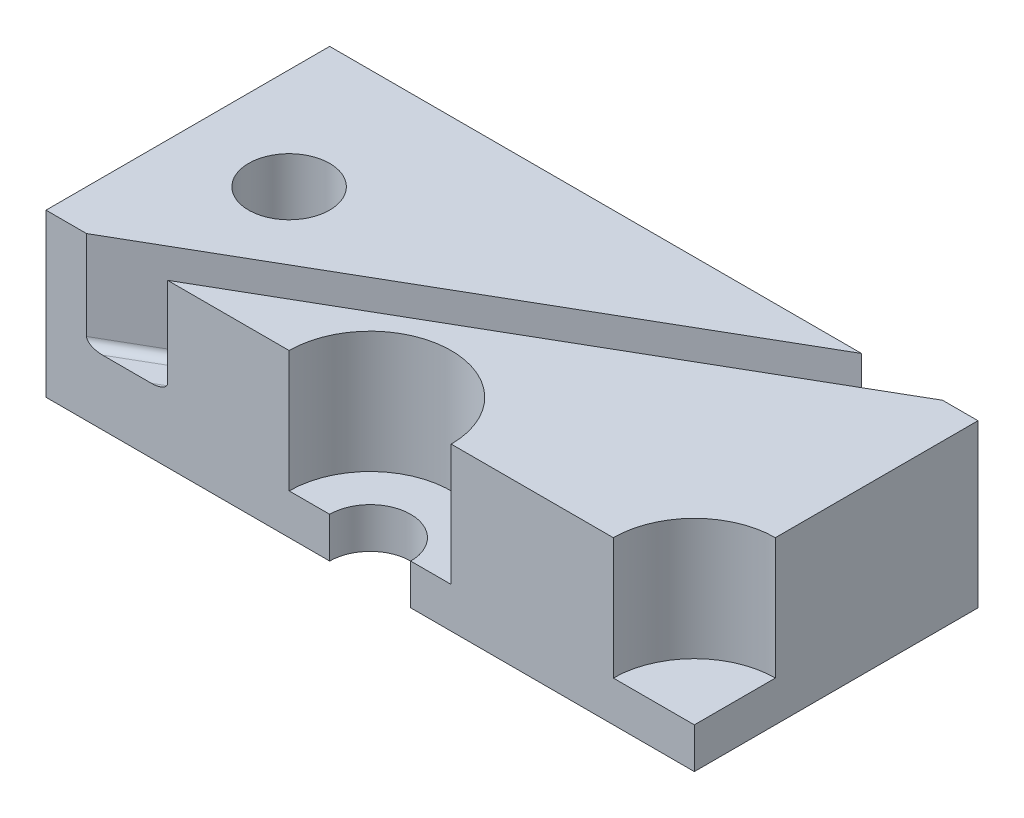
ISO-10303-21;
HEADER;
FILE_DESCRIPTION(('STEP AP214'),'2;1');
FILE_NAME('part.step','',(''),(''),'','','');
FILE_SCHEMA(('AUTOMOTIVE_DESIGN { 1 0 10303 214 1 1 1 1 }'));
ENDSEC;
DATA;
#1=APPLICATION_CONTEXT('core data for automotive mechanical design processes');
#2=APPLICATION_PROTOCOL_DEFINITION('international standard','automotive_design',2000,#1);
#3=PRODUCT_CONTEXT('',#1,'mechanical');
#4=PRODUCT('Part','Part','',(#3));
#5=PRODUCT_RELATED_PRODUCT_CATEGORY('part','',(#4));
#6=PRODUCT_DEFINITION_FORMATION('','',#4);
#7=PRODUCT_DEFINITION_CONTEXT('part definition',#1,'design');
#8=PRODUCT_DEFINITION('design','',#6,#7);
#9=PRODUCT_DEFINITION_SHAPE('','',#8);
#10=(LENGTH_UNIT() NAMED_UNIT(*) SI_UNIT(.MILLI.,.METRE.));
#11=(NAMED_UNIT(*) PLANE_ANGLE_UNIT() SI_UNIT($,.RADIAN.));
#12=(NAMED_UNIT(*) SI_UNIT($,.STERADIAN.) SOLID_ANGLE_UNIT());
#13=UNCERTAINTY_MEASURE_WITH_UNIT(LENGTH_MEASURE(1.E-05),#10,'distance_accuracy_value','');
#14=(GEOMETRIC_REPRESENTATION_CONTEXT(3) GLOBAL_UNCERTAINTY_ASSIGNED_CONTEXT((#13)) GLOBAL_UNIT_ASSIGNED_CONTEXT((#10,
#11,#12)) REPRESENTATION_CONTEXT('',''));
#15=CARTESIAN_POINT('',(0.,0.,0.));
#16=DIRECTION('',(0.,0.,1.));
#17=DIRECTION('',(1.,0.,0.));
#18=AXIS2_PLACEMENT_3D('',#15,#16,#17);
#19=CARTESIAN_POINT('',(120.996363636343,84.2718637239819,88.9));
#20=DIRECTION('',(0.,-1.,0.));
#21=DIRECTION('',(1.,0.,0.));
#22=AXIS2_PLACEMENT_3D('',#19,#20,#21);
#23=PLANE('',#22);
#24=CARTESIAN_POINT('',(-50.4536363636565,84.2718637239819,44.45));
#25=DIRECTION('',(0.,1.,0.));
#26=DIRECTION('',(-1.,0.,0.));
#27=AXIS2_PLACEMENT_3D('',#24,#25,#26);
#28=CIRCLE('',#27,12.7);
#29=CARTESIAN_POINT('',(-63.1536363636565,84.2718637239819,44.45));
#30=VERTEX_POINT('',#29);
#31=EDGE_CURVE('E269',#30,#30,#28,.T.);
#32=ORIENTED_EDGE('',*,*,#31,.F.);
#33=EDGE_LOOP('',(#32));
#34=FACE_BOUND('',#33,.T.);
#35=DIRECTION('',(-1.,0.,0.));
#36=VECTOR('',#35,1.);
#37=CARTESIAN_POINT('',(120.996363636343,84.2718637239819,88.9));
#38=LINE('',#37,#36);
#39=CARTESIAN_POINT('',(-69.5036363636565,84.2718637239819,88.9));
#40=VERTEX_POINT('',#39);
#41=CARTESIAN_POINT('',(-82.2036363636565,84.2718637239819,88.9));
#42=VERTEX_POINT('',#41);
#43=EDGE_CURVE('E181',#40,#42,#38,.T.);
#44=ORIENTED_EDGE('',*,*,#43,.F.);
#45=DIRECTION('',(-0.866025403784438,0.,0.500000000000001));
#46=VECTOR('',#45,1.);
#47=CARTESIAN_POINT('',(-69.5036363636565,84.2718637239819,88.9));
#48=LINE('',#47,#46);
#49=CARTESIAN_POINT('',(84.4756804292161,84.2718637239819,0.));
#50=VERTEX_POINT('',#49);
#51=EDGE_CURVE('E174',#50,#40,#48,.T.);
#52=ORIENTED_EDGE('',*,*,#51,.F.);
#53=DIRECTION('',(-1.,0.,0.));
#54=VECTOR('',#53,1.);
#55=CARTESIAN_POINT('',(120.996363636343,84.2718637239819,0.));
#56=LINE('',#55,#54);
#57=CARTESIAN_POINT('',(-82.2036363636565,84.2718637239819,0.));
#58=VERTEX_POINT('',#57);
#59=EDGE_CURVE('E198',#50,#58,#56,.T.);
#60=ORIENTED_EDGE('',*,*,#59,.T.);
#61=DIRECTION('',(0.,0.,-1.));
#62=VECTOR('',#61,1.);
#63=CARTESIAN_POINT('',(-82.2036363636565,84.2718637239819,88.9));
#64=LINE('',#63,#62);
#65=EDGE_CURVE('E184',#42,#58,#64,.T.);
#66=ORIENTED_EDGE('',*,*,#65,.F.);
#67=EDGE_LOOP('',(#44,#52,#60,#66));
#68=FACE_BOUND('',#67,.T.);
#69=ADVANCED_FACE('F43',(#34,#68),#23,.F.);
#70=CARTESIAN_POINT('',(0.,0.,88.9));
#71=DIRECTION('',(0.,0.,1.));
#72=DIRECTION('',(1.,0.,0.));
#73=AXIS2_PLACEMENT_3D('',#70,#71,#72);
#74=PLANE('',#73);
#75=DIRECTION('',(0.,1.,0.));
#76=VECTOR('',#75,1.);
#77=CARTESIAN_POINT('',(32.0963636363435,33.4718637239819,88.9));
#78=LINE('',#77,#76);
#79=CARTESIAN_POINT('',(32.0963636363435,33.4718637239819,88.9));
#80=VERTEX_POINT('',#79);
#81=CARTESIAN_POINT('',(32.0963636363435,46.1718637239819,88.9));
#82=VERTEX_POINT('',#81);
#83=EDGE_CURVE('E262',#80,#82,#78,.T.);
#84=ORIENTED_EDGE('',*,*,#83,.F.);
#85=DIRECTION('',(1.,0.,0.));
#86=VECTOR('',#85,1.);
#87=CARTESIAN_POINT('',(-82.2036363636565,33.4718637239819,88.9));
#88=LINE('',#87,#86);
#89=CARTESIAN_POINT('',(120.996363636343,33.4718637239819,88.9));
#90=VERTEX_POINT('',#89);
#91=EDGE_CURVE('E284',#80,#90,#88,.T.);
#92=ORIENTED_EDGE('',*,*,#91,.T.);
#93=DIRECTION('',(0.,1.,0.));
#94=VECTOR('',#93,1.);
#95=CARTESIAN_POINT('',(120.996363636343,33.4718637239819,88.9));
#96=LINE('',#95,#94);
#97=CARTESIAN_POINT('',(120.996363636343,46.1718637239819,88.9));
#98=VERTEX_POINT('',#97);
#99=EDGE_CURVE('E185',#90,#98,#96,.T.);
#100=ORIENTED_EDGE('',*,*,#99,.T.);
#101=DIRECTION('',(-1.,0.,0.));
#102=VECTOR('',#101,1.);
#103=CARTESIAN_POINT('',(0.,46.1718637239819,88.9));
#104=LINE('',#103,#102);
#105=CARTESIAN_POINT('',(95.5963636363434,46.1718637239819,88.9));
#106=VERTEX_POINT('',#105);
#107=EDGE_CURVE('E211',#98,#106,#104,.T.);
#108=ORIENTED_EDGE('',*,*,#107,.T.);
#109=DIRECTION('',(0.,1.,0.));
#110=VECTOR('',#109,1.);
#111=CARTESIAN_POINT('',(95.5963636363434,46.1718637239819,88.9));
#112=LINE('',#111,#110);
#113=CARTESIAN_POINT('',(95.5963636363434,84.2718637239819,88.9));
#114=VERTEX_POINT('',#113);
#115=EDGE_CURVE('E214',#114,#106,#112,.F.);
#116=ORIENTED_EDGE('',*,*,#115,.F.);
#117=CARTESIAN_POINT('',(44.7963636363435,84.2718637239819,88.9));
#118=VERTEX_POINT('',#117);
#119=EDGE_CURVE('E180',#114,#118,#38,.T.);
#120=ORIENTED_EDGE('',*,*,#119,.T.);
#121=DIRECTION('',(0.,1.,0.));
#122=VECTOR('',#121,1.);
#123=CARTESIAN_POINT('',(44.7963636363435,46.1718637239819,88.9));
#124=LINE('',#123,#122);
#125=CARTESIAN_POINT('',(44.7963636363435,46.1718637239819,88.9));
#126=VERTEX_POINT('',#125);
#127=EDGE_CURVE('E222',#126,#118,#124,.T.);
#128=ORIENTED_EDGE('',*,*,#127,.F.);
#129=DIRECTION('',(-1.,0.,0.));
#130=VECTOR('',#129,1.);
#131=CARTESIAN_POINT('',(0.,46.1718637239819,88.9));
#132=LINE('',#131,#130);
#133=EDGE_CURVE('E218',#126,#82,#132,.T.);
#134=ORIENTED_EDGE('',*,*,#133,.T.);
#135=EDGE_LOOP('',(#84,#92,#100,#108,#116,#120,#128,#134));
#136=FACE_BOUND('',#135,.T.);
#137=ADVANCED_FACE('F293',(#136),#74,.T.);
#138=CARTESIAN_POINT('',(-82.2036363636565,84.2718637239819,88.9));
#139=DIRECTION('',(1.,0.,0.));
#140=DIRECTION('',(0.,0.,-1.));
#141=AXIS2_PLACEMENT_3D('',#138,#139,#140);
#142=PLANE('',#141);
#143=DIRECTION('',(0.,-1.,0.));
#144=VECTOR('',#143,1.);
#145=CARTESIAN_POINT('',(-82.2036363636565,84.2718637239819,0.));
#146=LINE('',#145,#144);
#147=CARTESIAN_POINT('',(-82.2036363636565,33.4718637239819,0.));
#148=VERTEX_POINT('',#147);
#149=EDGE_CURVE('E189',#58,#148,#146,.T.);
#150=ORIENTED_EDGE('',*,*,#149,.T.);
#151=DIRECTION('',(0.,0.,-1.));
#152=VECTOR('',#151,1.);
#153=CARTESIAN_POINT('',(-82.2036363636565,33.4718637239819,88.9));
#154=LINE('',#153,#152);
#155=CARTESIAN_POINT('',(-82.2036363636565,33.4718637239819,88.9));
#156=VERTEX_POINT('',#155);
#157=EDGE_CURVE('E208',#156,#148,#154,.T.);
#158=ORIENTED_EDGE('',*,*,#157,.F.);
#159=DIRECTION('',(0.,-1.,0.));
#160=VECTOR('',#159,1.);
#161=CARTESIAN_POINT('',(-82.2036363636565,84.2718637239819,88.9));
#162=LINE('',#161,#160);
#163=EDGE_CURVE('E200',#42,#156,#162,.T.);
#164=ORIENTED_EDGE('',*,*,#163,.F.);
#165=ORIENTED_EDGE('',*,*,#65,.T.);
#166=EDGE_LOOP('',(#150,#158,#164,#165));
#167=FACE_BOUND('',#166,.T.);
#168=ADVANCED_FACE('F325',(#167),#142,.F.);
#169=CARTESIAN_POINT('',(-82.2036363636565,33.4718637239819,88.9));
#170=DIRECTION('',(0.,1.,0.));
#171=DIRECTION('',(0.,0.,1.));
#172=AXIS2_PLACEMENT_3D('',#169,#170,#171);
#173=PLANE('',#172);
#174=ORIENTED_EDGE('',*,*,#91,.F.);
#175=CARTESIAN_POINT('',(19.3963636363435,33.4718637239819,88.9));
#176=DIRECTION('',(0.,1.,0.));
#177=DIRECTION('',(-1.,0.,0.));
#178=AXIS2_PLACEMENT_3D('',#175,#176,#177);
#179=CIRCLE('',#178,12.7);
#180=CARTESIAN_POINT('',(6.69636363634348,33.4718637239819,88.9));
#181=VERTEX_POINT('',#180);
#182=EDGE_CURVE('E257',#80,#181,#179,.T.);
#183=ORIENTED_EDGE('',*,*,#182,.T.);
#184=EDGE_CURVE('E285',#156,#181,#88,.T.);
#185=ORIENTED_EDGE('',*,*,#184,.F.);
#186=ORIENTED_EDGE('',*,*,#157,.T.);
#187=DIRECTION('',(1.,0.,0.));
#188=VECTOR('',#187,1.);
#189=CARTESIAN_POINT('',(-82.2036363636565,33.4718637239819,0.));
#190=LINE('',#189,#188);
#191=CARTESIAN_POINT('',(120.996363636343,33.4718637239819,0.));
#192=VERTEX_POINT('',#191);
#193=EDGE_CURVE('E192',#148,#192,#190,.T.);
#194=ORIENTED_EDGE('',*,*,#193,.T.);
#195=DIRECTION('',(0.,0.,-1.));
#196=VECTOR('',#195,1.);
#197=CARTESIAN_POINT('',(120.996363636343,33.4718637239819,88.9));
#198=LINE('',#197,#196);
#199=EDGE_CURVE('E205',#90,#192,#198,.T.);
#200=ORIENTED_EDGE('',*,*,#199,.F.);
#201=EDGE_LOOP('',(#174,#183,#185,#186,#194,#200));
#202=FACE_BOUND('',#201,.T.);
#203=ADVANCED_FACE('F296',(#202),#173,.F.);
#204=CARTESIAN_POINT('',(120.996363636343,33.4718637239819,88.9));
#205=DIRECTION('',(-1.,0.,0.));
#206=DIRECTION('',(0.,0.,1.));
#207=AXIS2_PLACEMENT_3D('',#204,#205,#206);
#208=PLANE('',#207);
#209=DIRECTION('',(0.,0.,-1.));
#210=VECTOR('',#209,1.);
#211=CARTESIAN_POINT('',(120.996363636343,84.2718637239819,88.9));
#212=LINE('',#211,#210);
#213=CARTESIAN_POINT('',(120.996363636343,84.2718637239819,63.5));
#214=VERTEX_POINT('',#213);
#215=CARTESIAN_POINT('',(120.996363636343,84.2718637239819,0.));
#216=VERTEX_POINT('',#215);
#217=EDGE_CURVE('E203',#214,#216,#212,.T.);
#218=ORIENTED_EDGE('',*,*,#217,.F.);
#219=DIRECTION('',(0.,1.,0.));
#220=VECTOR('',#219,1.);
#221=CARTESIAN_POINT('',(120.996363636343,46.1718637239819,63.5));
#222=LINE('',#221,#220);
#223=CARTESIAN_POINT('',(120.996363636343,46.1718637239819,63.5));
#224=VERTEX_POINT('',#223);
#225=EDGE_CURVE('E193',#214,#224,#222,.F.);
#226=ORIENTED_EDGE('',*,*,#225,.T.);
#227=DIRECTION('',(0.,0.,-1.));
#228=VECTOR('',#227,1.);
#229=CARTESIAN_POINT('',(120.996363636343,46.1718637239819,88.9));
#230=LINE('',#229,#228);
#231=EDGE_CURVE('E268',#98,#224,#230,.T.);
#232=ORIENTED_EDGE('',*,*,#231,.F.);
#233=ORIENTED_EDGE('',*,*,#99,.F.);
#234=ORIENTED_EDGE('',*,*,#199,.T.);
#235=DIRECTION('',(0.,1.,0.));
#236=VECTOR('',#235,1.);
#237=CARTESIAN_POINT('',(120.996363636343,33.4718637239819,0.));
#238=LINE('',#237,#236);
#239=EDGE_CURVE('E195',#192,#216,#238,.T.);
#240=ORIENTED_EDGE('',*,*,#239,.T.);
#241=EDGE_LOOP('',(#218,#226,#232,#233,#234,#240));
#242=FACE_BOUND('',#241,.T.);
#243=ADVANCED_FACE('F301',(#242),#208,.F.);
#244=CARTESIAN_POINT('',(109.875680429216,84.2718637239819,0.));
#245=VERTEX_POINT('',#244);
#246=EDGE_CURVE('E173',#216,#245,#56,.T.);
#247=ORIENTED_EDGE('',*,*,#246,.T.);
#248=DIRECTION('',(0.866025403784438,0.,-0.500000000000001));
#249=VECTOR('',#248,1.);
#250=CARTESIAN_POINT('',(109.875680429216,84.2718637239819,0.));
#251=LINE('',#250,#249);
#252=CARTESIAN_POINT('',(-44.1036363636565,84.2718637239819,88.9));
#253=VERTEX_POINT('',#252);
#254=EDGE_CURVE('E158',#253,#245,#251,.T.);
#255=ORIENTED_EDGE('',*,*,#254,.F.);
#256=CARTESIAN_POINT('',(-6.00363636365652,84.2718637239819,88.9));
#257=VERTEX_POINT('',#256);
#258=EDGE_CURVE('E171',#257,#253,#38,.T.);
#259=ORIENTED_EDGE('',*,*,#258,.F.);
#260=CARTESIAN_POINT('',(19.3963636363435,84.2718637239819,88.9));
#261=DIRECTION('',(0.,1.,0.));
#262=DIRECTION('',(-1.,0.,0.));
#263=AXIS2_PLACEMENT_3D('',#260,#261,#262);
#264=CIRCLE('',#263,25.4);
#265=EDGE_CURVE('E272',#118,#257,#264,.T.);
#266=ORIENTED_EDGE('',*,*,#265,.F.);
#267=ORIENTED_EDGE('',*,*,#119,.F.);
#268=CARTESIAN_POINT('',(120.996363636343,84.2718637239819,88.9));
#269=DIRECTION('',(0.,1.,0.));
#270=DIRECTION('',(-1.,0.,0.));
#271=AXIS2_PLACEMENT_3D('',#268,#269,#270);
#272=CIRCLE('',#271,25.4);
#273=EDGE_CURVE('E277',#214,#114,#272,.T.);
#274=ORIENTED_EDGE('',*,*,#273,.F.);
#275=ORIENTED_EDGE('',*,*,#217,.T.);
#276=EDGE_LOOP('',(#247,#255,#259,#266,#267,#274,#275));
#277=FACE_BOUND('',#276,.T.);
#278=ADVANCED_FACE('F169',(#277),#23,.F.);
#279=DIRECTION('',(1.,0.,0.));
#280=VECTOR('',#279,1.);
#281=CARTESIAN_POINT('',(-44.1036363636565,53.7918637239819,88.9));
#282=LINE('',#281,#280);
#283=CARTESIAN_POINT('',(-64.4236363636566,53.7918637239819,88.9));
#284=VERTEX_POINT('',#283);
#285=CARTESIAN_POINT('',(-49.1836363636566,53.7918637239819,88.9));
#286=VERTEX_POINT('',#285);
#287=EDGE_CURVE('E238',#284,#286,#282,.T.);
#288=ORIENTED_EDGE('',*,*,#287,.F.);
#289=CARTESIAN_POINT('',(-64.4236363636566,56.3318637239819,88.9));
#290=DIRECTION('',(0.,0.,1.));
#291=DIRECTION('',(1.,0.,0.));
#292=AXIS2_PLACEMENT_3D('',#289,#290,#291);
#293=ELLIPSE('',#292,5.07999999999999,2.54);
#294=CARTESIAN_POINT('',(-69.5036363636565,56.3318637239819,88.9));
#295=VERTEX_POINT('',#294);
#296=EDGE_CURVE('E51',#284,#295,#293,.F.);
#297=ORIENTED_EDGE('',*,*,#296,.T.);
#298=DIRECTION('',(0.,1.,0.));
#299=VECTOR('',#298,1.);
#300=CARTESIAN_POINT('',(-69.5036363636565,53.7918637239819,88.9));
#301=LINE('',#300,#299);
#302=EDGE_CURVE('E253',#295,#40,#301,.T.);
#303=ORIENTED_EDGE('',*,*,#302,.T.);
#304=ORIENTED_EDGE('',*,*,#43,.T.);
#305=ORIENTED_EDGE('',*,*,#163,.T.);
#306=ORIENTED_EDGE('',*,*,#184,.T.);
#307=DIRECTION('',(0.,1.,0.));
#308=VECTOR('',#307,1.);
#309=CARTESIAN_POINT('',(6.69636363634348,33.4718637239819,88.9));
#310=LINE('',#309,#308);
#311=CARTESIAN_POINT('',(6.69636363634347,46.1718637239819,88.9));
#312=VERTEX_POINT('',#311);
#313=EDGE_CURVE('E260',#312,#181,#310,.F.);
#314=ORIENTED_EDGE('',*,*,#313,.F.);
#315=CARTESIAN_POINT('',(-6.00363636365652,46.1718637239819,88.9));
#316=VERTEX_POINT('',#315);
#317=EDGE_CURVE('E217',#312,#316,#132,.T.);
#318=ORIENTED_EDGE('',*,*,#317,.T.);
#319=DIRECTION('',(0.,1.,0.));
#320=VECTOR('',#319,1.);
#321=CARTESIAN_POINT('',(-6.00363636365651,46.1718637239819,88.9));
#322=LINE('',#321,#320);
#323=EDGE_CURVE('E179',#257,#316,#322,.F.);
#324=ORIENTED_EDGE('',*,*,#323,.F.);
#325=ORIENTED_EDGE('',*,*,#258,.T.);
#326=DIRECTION('',(0.,1.,0.));
#327=VECTOR('',#326,1.);
#328=CARTESIAN_POINT('',(-44.1036363636565,53.7918637239819,88.9));
#329=LINE('',#328,#327);
#330=CARTESIAN_POINT('',(-44.1036363636565,56.3318637239819,88.9));
#331=VERTEX_POINT('',#330);
#332=EDGE_CURVE('E154',#331,#253,#329,.T.);
#333=ORIENTED_EDGE('',*,*,#332,.F.);
#334=CARTESIAN_POINT('',(-49.1836363636566,56.3318637239819,88.9));
#335=DIRECTION('',(0.,0.,1.));
#336=DIRECTION('',(-1.,0.,0.));
#337=AXIS2_PLACEMENT_3D('',#334,#335,#336);
#338=ELLIPSE('',#337,5.07999999999999,2.54);
#339=EDGE_CURVE('E236',#331,#286,#338,.F.);
#340=ORIENTED_EDGE('',*,*,#339,.T.);
#341=EDGE_LOOP('',(#288,#297,#303,#304,#305,#306,#314,#318,#324,#325,#333,#340));
#342=FACE_BOUND('',#341,.T.);
#343=ADVANCED_FACE('F177',(#342),#74,.T.);
#344=CARTESIAN_POINT('',(0.,0.,0.));
#345=DIRECTION('',(0.,0.,1.));
#346=DIRECTION('',(1.,0.,0.));
#347=AXIS2_PLACEMENT_3D('',#344,#345,#346);
#348=PLANE('',#347);
#349=ORIENTED_EDGE('',*,*,#59,.F.);
#350=DIRECTION('',(0.,1.,0.));
#351=VECTOR('',#350,1.);
#352=CARTESIAN_POINT('',(84.4756804292161,53.7918637239819,0.));
#353=LINE('',#352,#351);
#354=CARTESIAN_POINT('',(84.4756804292161,56.3318637239819,0.));
#355=VERTEX_POINT('',#354);
#356=EDGE_CURVE('E251',#355,#50,#353,.T.);
#357=ORIENTED_EDGE('',*,*,#356,.F.);
#358=CARTESIAN_POINT('',(89.5556804292161,56.3318637239819,0.));
#359=DIRECTION('',(0.,0.,1.));
#360=DIRECTION('',(1.,0.,0.));
#361=AXIS2_PLACEMENT_3D('',#358,#359,#360);
#362=ELLIPSE('',#361,5.07999999999999,2.54);
#363=CARTESIAN_POINT('',(89.5556804292161,53.7918637239819,0.));
#364=VERTEX_POINT('',#363);
#365=EDGE_CURVE('E11',#355,#364,#362,.T.);
#366=ORIENTED_EDGE('',*,*,#365,.T.);
#367=DIRECTION('',(-1.,0.,0.));
#368=VECTOR('',#367,1.);
#369=CARTESIAN_POINT('',(84.4756804292161,53.7918637239819,0.));
#370=LINE('',#369,#368);
#371=CARTESIAN_POINT('',(104.795680429216,53.7918637239819,0.));
#372=VERTEX_POINT('',#371);
#373=EDGE_CURVE('E165',#372,#364,#370,.T.);
#374=ORIENTED_EDGE('',*,*,#373,.F.);
#375=CARTESIAN_POINT('',(104.795680429216,56.3318637239819,0.));
#376=DIRECTION('',(0.,0.,1.));
#377=DIRECTION('',(-1.,0.,0.));
#378=AXIS2_PLACEMENT_3D('',#375,#376,#377);
#379=ELLIPSE('',#378,5.07999999999999,2.54);
#380=CARTESIAN_POINT('',(109.875680429216,56.3318637239819,0.));
#381=VERTEX_POINT('',#380);
#382=EDGE_CURVE('E234',#372,#381,#379,.T.);
#383=ORIENTED_EDGE('',*,*,#382,.T.);
#384=DIRECTION('',(0.,1.,0.));
#385=VECTOR('',#384,1.);
#386=CARTESIAN_POINT('',(109.875680429216,53.7918637239819,0.));
#387=LINE('',#386,#385);
#388=EDGE_CURVE('E164',#381,#245,#387,.T.);
#389=ORIENTED_EDGE('',*,*,#388,.T.);
#390=ORIENTED_EDGE('',*,*,#246,.F.);
#391=ORIENTED_EDGE('',*,*,#239,.F.);
#392=ORIENTED_EDGE('',*,*,#193,.F.);
#393=ORIENTED_EDGE('',*,*,#149,.F.);
#394=EDGE_LOOP('',(#349,#357,#366,#374,#383,#389,#390,#391,#392,#393));
#395=FACE_BOUND('',#394,.T.);
#396=ADVANCED_FACE('F250',(#395),#348,.F.);
#397=CARTESIAN_POINT('',(120.996363636343,46.1718637239819,88.9));
#398=DIRECTION('',(0.,1.,0.));
#399=DIRECTION('',(-1.,0.,0.));
#400=AXIS2_PLACEMENT_3D('',#397,#398,#399);
#401=CYLINDRICAL_SURFACE('',#400,25.4);
#402=ORIENTED_EDGE('',*,*,#273,.T.);
#403=ORIENTED_EDGE('',*,*,#115,.T.);
#404=CARTESIAN_POINT('',(120.996363636343,46.1718637239819,88.9));
#405=DIRECTION('',(0.,1.,0.));
#406=DIRECTION('',(-1.,0.,0.));
#407=AXIS2_PLACEMENT_3D('',#404,#405,#406);
#408=CIRCLE('',#407,25.4);
#409=EDGE_CURVE('E264',#224,#106,#408,.T.);
#410=ORIENTED_EDGE('',*,*,#409,.F.);
#411=ORIENTED_EDGE('',*,*,#225,.F.);
#412=EDGE_LOOP('',(#402,#403,#410,#411));
#413=FACE_BOUND('',#412,.T.);
#414=ADVANCED_FACE('F306',(#413),#401,.F.);
#415=CARTESIAN_POINT('',(120.996363636343,46.1718637239819,88.9));
#416=DIRECTION('',(0.,1.,0.));
#417=DIRECTION('',(-1.,0.,0.));
#418=AXIS2_PLACEMENT_3D('',#415,#416,#417);
#419=PLANE('',#418);
#420=ORIENTED_EDGE('',*,*,#231,.T.);
#421=ORIENTED_EDGE('',*,*,#409,.T.);
#422=ORIENTED_EDGE('',*,*,#107,.F.);
#423=EDGE_LOOP('',(#420,#421,#422));
#424=FACE_BOUND('',#423,.T.);
#425=ADVANCED_FACE('F304',(#424),#419,.T.);
#426=CARTESIAN_POINT('',(19.3963636363435,46.1718637239819,88.9));
#427=DIRECTION('',(0.,1.,0.));
#428=DIRECTION('',(-1.,0.,0.));
#429=AXIS2_PLACEMENT_3D('',#426,#427,#428);
#430=CYLINDRICAL_SURFACE('',#429,25.4);
#431=ORIENTED_EDGE('',*,*,#127,.T.);
#432=ORIENTED_EDGE('',*,*,#265,.T.);
#433=ORIENTED_EDGE('',*,*,#323,.T.);
#434=CARTESIAN_POINT('',(19.3963636363435,46.1718637239819,88.9));
#435=DIRECTION('',(0.,1.,0.));
#436=DIRECTION('',(-1.,0.,0.));
#437=AXIS2_PLACEMENT_3D('',#434,#435,#436);
#438=CIRCLE('',#437,25.4);
#439=EDGE_CURVE('E274',#126,#316,#438,.T.);
#440=ORIENTED_EDGE('',*,*,#439,.F.);
#441=EDGE_LOOP('',(#431,#432,#433,#440));
#442=FACE_BOUND('',#441,.T.);
#443=ADVANCED_FACE('F312',(#442),#430,.F.);
#444=CARTESIAN_POINT('',(19.3963636363435,46.1718637239819,88.9));
#445=DIRECTION('',(0.,1.,0.));
#446=DIRECTION('',(-1.,0.,0.));
#447=AXIS2_PLACEMENT_3D('',#444,#445,#446);
#448=PLANE('',#447);
#449=CARTESIAN_POINT('',(19.3963636363435,46.1718637239819,88.9));
#450=DIRECTION('',(0.,1.,0.));
#451=DIRECTION('',(-1.,0.,0.));
#452=AXIS2_PLACEMENT_3D('',#449,#450,#451);
#453=CIRCLE('',#452,12.7);
#454=EDGE_CURVE('E224',#82,#312,#453,.T.);
#455=ORIENTED_EDGE('',*,*,#454,.F.);
#456=ORIENTED_EDGE('',*,*,#133,.F.);
#457=ORIENTED_EDGE('',*,*,#439,.T.);
#458=ORIENTED_EDGE('',*,*,#317,.F.);
#459=EDGE_LOOP('',(#455,#456,#457,#458));
#460=FACE_BOUND('',#459,.T.);
#461=ADVANCED_FACE('F316',(#460),#448,.T.);
#462=CARTESIAN_POINT('',(-50.4536363636565,46.1718637239819,44.45));
#463=DIRECTION('',(0.,1.,0.));
#464=DIRECTION('',(-1.,0.,0.));
#465=AXIS2_PLACEMENT_3D('',#462,#463,#464);
#466=CYLINDRICAL_SURFACE('',#465,12.7);
#467=CARTESIAN_POINT('',(-50.4536363636565,46.1718637239819,44.45));
#468=DIRECTION('',(0.,1.,0.));
#469=DIRECTION('',(-1.,0.,0.));
#470=AXIS2_PLACEMENT_3D('',#467,#468,#469);
#471=CIRCLE('',#470,12.7);
#472=CARTESIAN_POINT('',(-63.1536363636565,46.1718637239819,44.45));
#473=VERTEX_POINT('',#472);
#474=EDGE_CURVE('E265',#473,#473,#471,.T.);
#475=CARTESIAN_POINT('',(-63.1536363636565,46.1718637239819,44.45));
#476=CARTESIAN_POINT('',(-63.1536363636565,46.5687387239819,44.45));
#477=CARTESIAN_POINT('',(-63.1536363636565,46.9656137239819,44.45));
#478=CARTESIAN_POINT('',(-63.1536363636565,47.7593637239819,44.45));
#479=CARTESIAN_POINT('',(-63.1536363636565,48.1562387239819,44.45));
#480=CARTESIAN_POINT('',(-63.1536363636565,48.9499887239819,44.45));
#481=CARTESIAN_POINT('',(-63.1536363636565,49.3468637239819,44.45));
#482=CARTESIAN_POINT('',(-63.1536363636565,50.1406137239819,44.45));
#483=CARTESIAN_POINT('',(-63.1536363636565,50.5374887239819,44.45));
#484=CARTESIAN_POINT('',(-63.1536363636565,51.3312387239819,44.45));
#485=CARTESIAN_POINT('',(-63.1536363636565,51.7281137239819,44.45));
#486=CARTESIAN_POINT('',(-63.1536363636565,52.5218637239819,44.45));
#487=CARTESIAN_POINT('',(-63.1536363636565,52.9187387239819,44.45));
#488=CARTESIAN_POINT('',(-63.1536363636565,53.7124887239819,44.45));
#489=CARTESIAN_POINT('',(-63.1536363636565,54.1093637239819,44.45));
#490=CARTESIAN_POINT('',(-63.1536363636565,54.9031137239819,44.45));
#491=CARTESIAN_POINT('',(-63.1536363636565,55.2999887239819,44.45));
#492=CARTESIAN_POINT('',(-63.1536363636565,56.0937387239819,44.45));
#493=CARTESIAN_POINT('',(-63.1536363636565,56.4906137239819,44.45));
#494=CARTESIAN_POINT('',(-63.1536363636565,57.2843637239819,44.45));
#495=CARTESIAN_POINT('',(-63.1536363636565,57.6812387239819,44.45));
#496=CARTESIAN_POINT('',(-63.1536363636565,58.4749887239819,44.45));
#497=CARTESIAN_POINT('',(-63.1536363636565,58.8718637239819,44.45));
#498=CARTESIAN_POINT('',(-63.1536363636565,59.6656137239819,44.45));
#499=CARTESIAN_POINT('',(-63.1536363636565,60.0624887239819,44.45));
#500=CARTESIAN_POINT('',(-63.1536363636565,60.8562387239819,44.45));
#501=CARTESIAN_POINT('',(-63.1536363636565,61.2531137239819,44.45));
#502=CARTESIAN_POINT('',(-63.1536363636565,62.0468637239819,44.45));
#503=CARTESIAN_POINT('',(-63.1536363636565,62.4437387239819,44.45));
#504=CARTESIAN_POINT('',(-63.1536363636565,63.2374887239819,44.45));
#505=CARTESIAN_POINT('',(-63.1536363636565,63.6343637239819,44.45));
#506=CARTESIAN_POINT('',(-63.1536363636565,64.4281137239819,44.45));
#507=CARTESIAN_POINT('',(-63.1536363636565,64.8249887239819,44.45));
#508=CARTESIAN_POINT('',(-63.1536363636565,65.6187387239819,44.45));
#509=CARTESIAN_POINT('',(-63.1536363636565,66.0156137239819,44.45));
#510=CARTESIAN_POINT('',(-63.1536363636565,66.8093637239819,44.45));
#511=CARTESIAN_POINT('',(-63.1536363636565,67.2062387239819,44.45));
#512=CARTESIAN_POINT('',(-63.1536363636565,67.9999887239819,44.45));
#513=CARTESIAN_POINT('',(-63.1536363636565,68.3968637239819,44.45));
#514=CARTESIAN_POINT('',(-63.1536363636565,69.1906137239819,44.45));
#515=CARTESIAN_POINT('',(-63.1536363636565,69.5874887239819,44.45));
#516=CARTESIAN_POINT('',(-63.1536363636565,70.3812387239819,44.45));
#517=CARTESIAN_POINT('',(-63.1536363636565,70.7781137239819,44.45));
#518=CARTESIAN_POINT('',(-63.1536363636565,71.5718637239819,44.45));
#519=CARTESIAN_POINT('',(-63.1536363636565,71.9687387239819,44.45));
#520=CARTESIAN_POINT('',(-63.1536363636565,72.7624887239819,44.45));
#521=CARTESIAN_POINT('',(-63.1536363636565,73.1593637239819,44.45));
#522=CARTESIAN_POINT('',(-63.1536363636565,73.9531137239819,44.45));
#523=CARTESIAN_POINT('',(-63.1536363636565,74.3499887239819,44.45));
#524=CARTESIAN_POINT('',(-63.1536363636565,75.1437387239819,44.45));
#525=CARTESIAN_POINT('',(-63.1536363636565,75.5406137239819,44.45));
#526=CARTESIAN_POINT('',(-63.1536363636565,76.3343637239819,44.45));
#527=CARTESIAN_POINT('',(-63.1536363636565,76.7312387239819,44.45));
#528=CARTESIAN_POINT('',(-63.1536363636565,77.5249887239819,44.45));
#529=CARTESIAN_POINT('',(-63.1536363636565,77.9218637239819,44.45));
#530=CARTESIAN_POINT('',(-63.1536363636565,78.7156137239819,44.45));
#531=CARTESIAN_POINT('',(-63.1536363636565,79.1124887239819,44.45));
#532=CARTESIAN_POINT('',(-63.1536363636565,79.9062387239819,44.45));
#533=CARTESIAN_POINT('',(-63.1536363636565,80.3031137239819,44.45));
#534=CARTESIAN_POINT('',(-63.1536363636565,81.0968637239819,44.45));
#535=CARTESIAN_POINT('',(-63.1536363636565,81.4937387239819,44.45));
#536=CARTESIAN_POINT('',(-63.1536363636565,82.2874887239819,44.45));
#537=CARTESIAN_POINT('',(-63.1536363636565,82.6843637239819,44.45));
#538=CARTESIAN_POINT('',(-63.1536363636565,83.4781137239819,44.45));
#539=CARTESIAN_POINT('',(-63.1536363636565,83.8749887239819,44.45));
#540=CARTESIAN_POINT('',(-63.1536363636565,84.2718637239819,44.45));
#541=B_SPLINE_CURVE_WITH_KNOTS('',3,(#475,#476,#477,#478,#479,#480,#481,#482,#483,#484,#485,
#486,#487,#488,#489,#490,#491,#492,#493,#494,#495,#496,#497,#498,#499,#500,#501,#502,#503,#504,
#505,#506,#507,#508,#509,#510,#511,#512,#513,#514,#515,#516,#517,#518,#519,#520,#521,#522,#523,
#524,#525,#526,#527,#528,#529,#530,#531,#532,#533,#534,#535,#536,#537,#538,#539,#540),
.UNSPECIFIED.,.F.,.F.,(4,2,2,2,2,2,2,2,2,2,2,2,2,2,2,2,2,2,2,2,2,2,2,2,2,2,2,2,2,2,2,2,4),(0.,
1.19062499999999,2.38124999999999,3.571875,4.7625,5.953125,7.14375,8.334375,9.525,10.715625,
11.90625,13.096875,14.2875,15.478125,16.66875,17.859375,19.05,20.240625,21.43125,22.621875,
23.8125,25.003125,26.19375,27.384375,28.575,29.765625,30.95625,32.146875,33.3375,34.528125,
35.71875,36.909375,38.1),.UNSPECIFIED.);
#542=EDGE_CURVE('BSEAM426',#473,#30,#541,.T.);
#543=ORIENTED_EDGE('',*,*,#474,.F.);
#544=ORIENTED_EDGE('',*,*,#31,.T.);
#545=ORIENTED_EDGE('',*,*,#542,.T.);
#546=ORIENTED_EDGE('',*,*,#542,.F.);
#547=EDGE_LOOP('',(#543,#545,#544,#546));
#548=FACE_BOUND('',#547,.T.);
#549=ADVANCED_FACE('F426',(#548),#466,.F.);
#550=CARTESIAN_POINT('',(-50.4536363636565,46.1718637239819,44.45));
#551=DIRECTION('',(0.,1.,0.));
#552=DIRECTION('',(-1.,0.,0.));
#553=AXIS2_PLACEMENT_3D('',#550,#551,#552);
#554=PLANE('',#553);
#555=ORIENTED_EDGE('',*,*,#474,.T.);
#556=EDGE_LOOP('',(#555));
#557=FACE_BOUND('',#556,.T.);
#558=ADVANCED_FACE('F434',(#557),#554,.T.);
#559=CARTESIAN_POINT('',(19.3963636363435,33.4718637239819,88.9));
#560=DIRECTION('',(0.,1.,0.));
#561=DIRECTION('',(-1.,0.,0.));
#562=AXIS2_PLACEMENT_3D('',#559,#560,#561);
#563=CYLINDRICAL_SURFACE('',#562,12.7);
#564=ORIENTED_EDGE('',*,*,#83,.T.);
#565=ORIENTED_EDGE('',*,*,#454,.T.);
#566=ORIENTED_EDGE('',*,*,#313,.T.);
#567=ORIENTED_EDGE('',*,*,#182,.F.);
#568=EDGE_LOOP('',(#564,#565,#566,#567));
#569=FACE_BOUND('',#568,.T.);
#570=ADVANCED_FACE('F319',(#569),#563,.F.);
#571=CARTESIAN_POINT('',(-69.5036363636565,53.7918637239819,88.9));
#572=DIRECTION('',(-0.500000000000001,0.,-0.866025403784438));
#573=DIRECTION('',(-0.866025403784438,0.,0.500000000000001));
#574=AXIS2_PLACEMENT_3D('',#571,#572,#573);
#575=PLANE('',#574);
#576=ORIENTED_EDGE('',*,*,#302,.F.);
#577=DIRECTION('',(-0.866025403784438,0.,0.500000000000001));
#578=VECTOR('',#577,1.);
#579=CARTESIAN_POINT('',(84.4756804292161,56.3318637239819,0.));
#580=LINE('',#579,#578);
#581=EDGE_CURVE('E58',#295,#355,#580,.F.);
#582=ORIENTED_EDGE('',*,*,#581,.T.);
#583=ORIENTED_EDGE('',*,*,#356,.T.);
#584=ORIENTED_EDGE('',*,*,#51,.T.);
#585=EDGE_LOOP('',(#576,#582,#583,#584));
#586=FACE_BOUND('',#585,.T.);
#587=ADVANCED_FACE('F333',(#586),#575,.F.);
#588=CARTESIAN_POINT('',(109.875680429216,53.7918637239819,0.));
#589=DIRECTION('',(0.500000000000001,0.,0.866025403784438));
#590=DIRECTION('',(0.866025403784438,0.,-0.500000000000001));
#591=AXIS2_PLACEMENT_3D('',#588,#589,#590);
#592=PLANE('',#591);
#593=ORIENTED_EDGE('',*,*,#388,.F.);
#594=DIRECTION('',(0.866025403784438,0.,-0.500000000000001));
#595=VECTOR('',#594,1.);
#596=CARTESIAN_POINT('',(-44.1036363636565,56.3318637239819,88.9));
#597=LINE('',#596,#595);
#598=EDGE_CURVE('E161',#381,#331,#597,.F.);
#599=ORIENTED_EDGE('',*,*,#598,.T.);
#600=ORIENTED_EDGE('',*,*,#332,.T.);
#601=ORIENTED_EDGE('',*,*,#254,.T.);
#602=EDGE_LOOP('',(#593,#599,#600,#601));
#603=FACE_BOUND('',#602,.T.);
#604=ADVANCED_FACE('F157',(#603),#592,.F.);
#605=CARTESIAN_POINT('',(0.,53.7918637239819,0.));
#606=DIRECTION('',(0.,-1.,0.));
#607=DIRECTION('',(0.,0.,-1.));
#608=AXIS2_PLACEMENT_3D('',#605,#606,#607);
#609=PLANE('',#608);
#610=ORIENTED_EDGE('',*,*,#287,.T.);
#611=DIRECTION('',(0.866025403784438,0.,-0.500000000000001));
#612=VECTOR('',#611,1.);
#613=CARTESIAN_POINT('',(108.605680429216,53.7918637239819,-2.19970452561251));
#614=LINE('',#613,#612);
#615=EDGE_CURVE('E229',#286,#372,#614,.T.);
#616=ORIENTED_EDGE('',*,*,#615,.T.);
#617=ORIENTED_EDGE('',*,*,#373,.T.);
#618=DIRECTION('',(-0.866025403784438,0.,0.500000000000001));
#619=VECTOR('',#618,1.);
#620=CARTESIAN_POINT('',(-68.2336363636566,53.7918637239819,91.0997045256125));
#621=LINE('',#620,#619);
#622=EDGE_CURVE('E226',#364,#284,#621,.T.);
#623=ORIENTED_EDGE('',*,*,#622,.T.);
#624=EDGE_LOOP('',(#610,#616,#617,#623));
#625=FACE_BOUND('',#624,.T.);
#626=ADVANCED_FACE('F242',(#625),#609,.F.);
#627=CARTESIAN_POINT('',(26.1989201073041,56.3318637239819,45.3778607292885));
#628=DIRECTION('',(-0.866025403784438,0.,0.500000000000001));
#629=DIRECTION('',(0.500000000000001,0.,0.866025403784438));
#630=AXIS2_PLACEMENT_3D('',#627,#628,#629);
#631=CYLINDRICAL_SURFACE('',#630,2.54);
#632=ORIENTED_EDGE('',*,*,#339,.F.);
#633=ORIENTED_EDGE('',*,*,#598,.F.);
#634=ORIENTED_EDGE('',*,*,#382,.F.);
#635=ORIENTED_EDGE('',*,*,#615,.F.);
#636=EDGE_LOOP('',(#632,#633,#634,#635));
#637=FACE_BOUND('',#636,.T.);
#638=ADVANCED_FACE('F247',(#637),#631,.F.);
#639=CARTESIAN_POINT('',(22.3889201073041,56.3318637239819,38.7787471524511));
#640=DIRECTION('',(0.866025403784438,0.,-0.500000000000001));
#641=DIRECTION('',(-0.500000000000001,0.,-0.866025403784438));
#642=AXIS2_PLACEMENT_3D('',#639,#640,#641);
#643=CYLINDRICAL_SURFACE('',#642,2.54);
#644=ORIENTED_EDGE('',*,*,#365,.F.);
#645=ORIENTED_EDGE('',*,*,#581,.F.);
#646=ORIENTED_EDGE('',*,*,#296,.F.);
#647=ORIENTED_EDGE('',*,*,#622,.F.);
#648=EDGE_LOOP('',(#644,#645,#646,#647));
#649=FACE_BOUND('',#648,.T.);
#650=ADVANCED_FACE('F45',(#649),#643,.F.);
#651=CLOSED_SHELL('',(#69,#137,#168,#203,#243,#278,#343,#396,#414,#425,#443,#461,#549,#558,#570,
#587,#604,#626,#638,#650));
#652=MANIFOLD_SOLID_BREP('B2',#651);
#653=ADVANCED_BREP_SHAPE_REPRESENTATION('',(#18,#652),#14);
#654=SHAPE_DEFINITION_REPRESENTATION(#9,#653);
ENDSEC;
END-ISO-10303-21;
